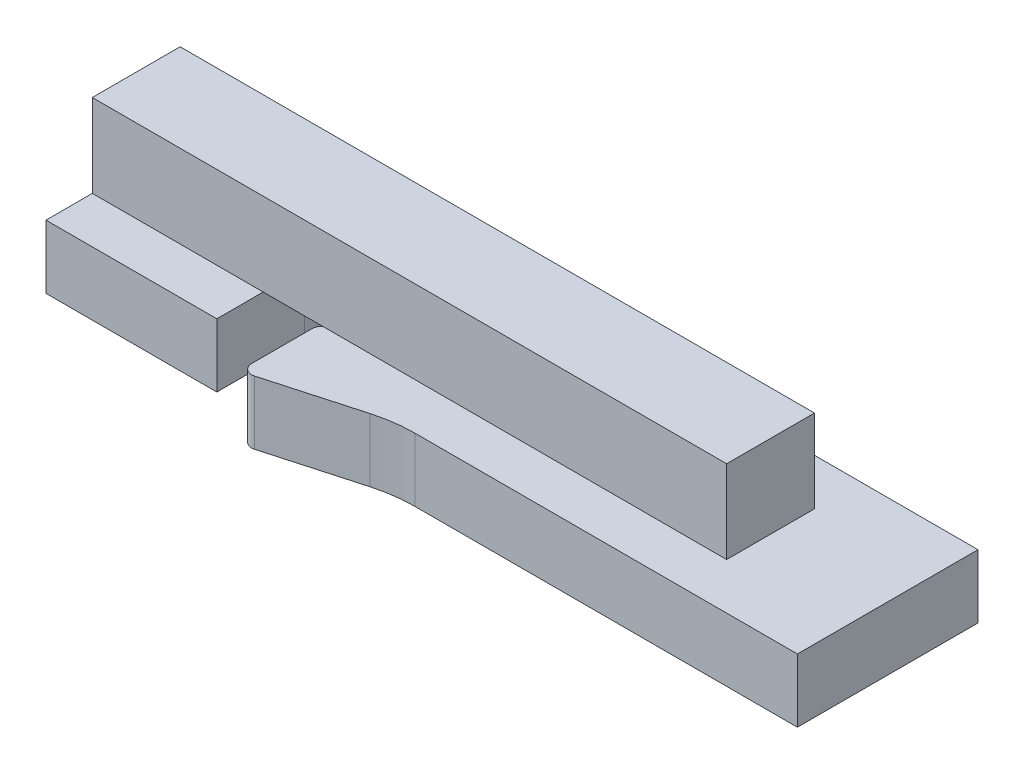
ISO-10303-21;
HEADER;
FILE_DESCRIPTION(('STEP AP214'),'2;1');
FILE_NAME('part.step','',(''),(''),'','','');
FILE_SCHEMA(('AUTOMOTIVE_DESIGN { 1 0 10303 214 1 1 1 1 }'));
ENDSEC;
DATA;
#1=APPLICATION_CONTEXT('core data for automotive mechanical design processes');
#2=APPLICATION_PROTOCOL_DEFINITION('international standard','automotive_design',2000,#1);
#3=PRODUCT_CONTEXT('',#1,'mechanical');
#4=PRODUCT('Part','Part','',(#3));
#5=PRODUCT_RELATED_PRODUCT_CATEGORY('part','',(#4));
#6=PRODUCT_DEFINITION_FORMATION('','',#4);
#7=PRODUCT_DEFINITION_CONTEXT('part definition',#1,'design');
#8=PRODUCT_DEFINITION('design','',#6,#7);
#9=PRODUCT_DEFINITION_SHAPE('','',#8);
#10=(LENGTH_UNIT() NAMED_UNIT(*) SI_UNIT(.MILLI.,.METRE.));
#11=(NAMED_UNIT(*) PLANE_ANGLE_UNIT() SI_UNIT($,.RADIAN.));
#12=(NAMED_UNIT(*) SI_UNIT($,.STERADIAN.) SOLID_ANGLE_UNIT());
#13=UNCERTAINTY_MEASURE_WITH_UNIT(LENGTH_MEASURE(1.E-05),#10,'distance_accuracy_value','');
#14=(GEOMETRIC_REPRESENTATION_CONTEXT(3) GLOBAL_UNCERTAINTY_ASSIGNED_CONTEXT((#13)) GLOBAL_UNIT_ASSIGNED_CONTEXT((#10,
#11,#12)) REPRESENTATION_CONTEXT('',''));
#15=CARTESIAN_POINT('',(0.,0.,0.));
#16=DIRECTION('',(0.,0.,1.));
#17=DIRECTION('',(1.,0.,0.));
#18=AXIS2_PLACEMENT_3D('',#15,#16,#17);
#19=CARTESIAN_POINT('',(0.,-299.515551231555,0.));
#20=DIRECTION('',(0.,-1.,0.));
#21=DIRECTION('',(0.,0.,-1.));
#22=AXIS2_PLACEMENT_3D('',#19,#20,#21);
#23=PLANE('',#22);
#24=DIRECTION('',(0.,0.,-1.));
#25=VECTOR('',#24,1.);
#26=CARTESIAN_POINT('',(4367.43626687539,-299.515551231555,24.1039140004574));
#27=LINE('',#26,#25);
#28=CARTESIAN_POINT('',(4367.43626687539,-299.515551231555,24.1039140004574));
#29=VERTEX_POINT('',#28);
#30=CARTESIAN_POINT('',(4367.43626687539,-299.515551231555,20.5039140004575));
#31=VERTEX_POINT('',#30);
#32=EDGE_CURVE('E351',#29,#31,#27,.T.);
#33=ORIENTED_EDGE('',*,*,#32,.F.);
#34=DIRECTION('',(-1.,0.,0.));
#35=VECTOR('',#34,1.);
#36=CARTESIAN_POINT('',(4367.43626687539,-299.515551231555,24.1039140004574));
#37=LINE('',#36,#35);
#38=CARTESIAN_POINT('',(4393.42735023895,-299.515551231555,24.1039140004575));
#39=VERTEX_POINT('',#38);
#40=EDGE_CURVE('E354',#39,#29,#37,.T.);
#41=ORIENTED_EDGE('',*,*,#40,.F.);
#42=DIRECTION('',(0.,0.,1.));
#43=VECTOR('',#42,1.);
#44=CARTESIAN_POINT('',(4393.42735023895,-299.515551231555,24.1039140004575));
#45=LINE('',#44,#43);
#46=CARTESIAN_POINT('',(4393.42735023895,-299.515551231555,20.5039140004575));
#47=VERTEX_POINT('',#46);
#48=EDGE_CURVE('E46',#47,#39,#45,.T.);
#49=ORIENTED_EDGE('',*,*,#48,.F.);
#50=DIRECTION('',(1.,0.,0.));
#51=VECTOR('',#50,1.);
#52=CARTESIAN_POINT('',(4367.43626687539,-299.515551231555,20.5039140004575));
#53=LINE('',#52,#51);
#54=EDGE_CURVE('E11',#31,#47,#53,.T.);
#55=ORIENTED_EDGE('',*,*,#54,.F.);
#56=EDGE_LOOP('',(#33,#41,#49,#55));
#57=FACE_BOUND('',#56,.T.);
#58=ADVANCED_FACE('F39',(#57),#23,.F.);
#59=CARTESIAN_POINT('',(4398.22735023895,-305.515551231555,18.6039140004575));
#60=DIRECTION('',(-1.,0.,0.));
#61=DIRECTION('',(0.,0.,1.));
#62=AXIS2_PLACEMENT_3D('',#59,#60,#61);
#63=PLANE('',#62);
#64=DIRECTION('',(0.,0.,1.));
#65=VECTOR('',#64,1.);
#66=CARTESIAN_POINT('',(4398.22735023895,-302.915551231555,18.6039140004575));
#67=LINE('',#66,#65);
#68=CARTESIAN_POINT('',(4398.22735023895,-302.915551231555,18.6039140004575));
#69=VERTEX_POINT('',#68);
#70=CARTESIAN_POINT('',(4398.22735023895,-302.915551231555,26.0039140004575));
#71=VERTEX_POINT('',#70);
#72=EDGE_CURVE('E185',#69,#71,#67,.T.);
#73=ORIENTED_EDGE('',*,*,#72,.T.);
#74=DIRECTION('',(0.,1.,0.));
#75=VECTOR('',#74,1.);
#76=CARTESIAN_POINT('',(4398.22735023895,-305.515551231555,26.0039140004575));
#77=LINE('',#76,#75);
#78=CARTESIAN_POINT('',(4398.22735023895,-305.515551231555,26.0039140004575));
#79=VERTEX_POINT('',#78);
#80=EDGE_CURVE('E189',#79,#71,#77,.T.);
#81=ORIENTED_EDGE('',*,*,#80,.F.);
#82=DIRECTION('',(0.,0.,1.));
#83=VECTOR('',#82,1.);
#84=CARTESIAN_POINT('',(4398.22735023895,-305.515551231555,18.6039140004575));
#85=LINE('',#84,#83);
#86=CARTESIAN_POINT('',(4398.22735023895,-305.515551231555,18.6039140004575));
#87=VERTEX_POINT('',#86);
#88=EDGE_CURVE('E214',#87,#79,#85,.T.);
#89=ORIENTED_EDGE('',*,*,#88,.F.);
#90=DIRECTION('',(0.,1.,0.));
#91=VECTOR('',#90,1.);
#92=CARTESIAN_POINT('',(4398.22735023895,-305.515551231555,18.6039140004575));
#93=LINE('',#92,#91);
#94=EDGE_CURVE('E192',#87,#69,#93,.T.);
#95=ORIENTED_EDGE('',*,*,#94,.T.);
#96=EDGE_LOOP('',(#73,#81,#89,#95));
#97=FACE_BOUND('',#96,.T.);
#98=ADVANCED_FACE('F187',(#97),#63,.F.);
#99=CARTESIAN_POINT('',(4389.42735023895,-305.515551231555,26.0039140004575));
#100=DIRECTION('',(0.,0.,-1.));
#101=DIRECTION('',(-1.,0.,0.));
#102=AXIS2_PLACEMENT_3D('',#99,#100,#101);
#103=PLANE('',#102);
#104=DIRECTION('',(-1.,0.,0.));
#105=VECTOR('',#104,1.);
#106=CARTESIAN_POINT('',(4389.42735023895,-302.915551231555,26.0039140004575));
#107=LINE('',#106,#105);
#108=CARTESIAN_POINT('',(4382.56517111144,-302.915551231555,26.0039140004575));
#109=VERTEX_POINT('',#108);
#110=EDGE_CURVE('E197',#71,#109,#107,.T.);
#111=ORIENTED_EDGE('',*,*,#110,.T.);
#112=DIRECTION('',(0.,-1.,0.));
#113=VECTOR('',#112,1.);
#114=CARTESIAN_POINT('',(4382.56517111144,-305.515551231555,26.0039140004575));
#115=LINE('',#114,#113);
#116=CARTESIAN_POINT('',(4382.56517111144,-305.515551231555,26.0039140004575));
#117=VERTEX_POINT('',#116);
#118=EDGE_CURVE('E386',#109,#117,#115,.T.);
#119=ORIENTED_EDGE('',*,*,#118,.T.);
#120=DIRECTION('',(-1.,0.,0.));
#121=VECTOR('',#120,1.);
#122=CARTESIAN_POINT('',(4389.42735023895,-305.515551231555,26.0039140004575));
#123=LINE('',#122,#121);
#124=EDGE_CURVE('E205',#79,#117,#123,.T.);
#125=ORIENTED_EDGE('',*,*,#124,.F.);
#126=ORIENTED_EDGE('',*,*,#80,.T.);
#127=EDGE_LOOP('',(#111,#119,#125,#126));
#128=FACE_BOUND('',#127,.T.);
#129=ADVANCED_FACE('F201',(#128),#103,.F.);
#130=CARTESIAN_POINT('',(4382.56517111144,-305.515551231555,32.0039140004575));
#131=DIRECTION('',(0.,-1.,0.));
#132=DIRECTION('',(0.,0.,-1.));
#133=AXIS2_PLACEMENT_3D('',#130,#131,#132);
#134=CYLINDRICAL_SURFACE('',#133,6.);
#135=CARTESIAN_POINT('',(4382.56517111144,-302.915551231555,32.0039140004575));
#136=DIRECTION('',(0.,-1.,0.));
#137=DIRECTION('',(0.,0.,-1.));
#138=AXIS2_PLACEMENT_3D('',#135,#136,#137);
#139=CIRCLE('',#138,6.);
#140=CARTESIAN_POINT('',(4380.94739155832,-302.915551231555,26.2261298821723));
#141=VERTEX_POINT('',#140);
#142=EDGE_CURVE('E210',#141,#109,#139,.T.);
#143=ORIENTED_EDGE('',*,*,#142,.F.);
#144=DIRECTION('',(0.,-1.,0.));
#145=VECTOR('',#144,1.);
#146=CARTESIAN_POINT('',(4380.94739155832,-289.781512159042,26.2261298821723));
#147=LINE('',#146,#145);
#148=CARTESIAN_POINT('',(4380.94739155832,-305.515551231555,26.2261298821723));
#149=VERTEX_POINT('',#148);
#150=EDGE_CURVE('E388',#149,#141,#147,.F.);
#151=ORIENTED_EDGE('',*,*,#150,.F.);
#152=CARTESIAN_POINT('',(4382.56517111144,-305.515551231555,32.0039140004575));
#153=DIRECTION('',(0.,-1.,0.));
#154=DIRECTION('',(0.,0.,-1.));
#155=AXIS2_PLACEMENT_3D('',#152,#153,#154);
#156=CIRCLE('',#155,6.);
#157=EDGE_CURVE('E400',#117,#149,#156,.F.);
#158=ORIENTED_EDGE('',*,*,#157,.F.);
#159=ORIENTED_EDGE('',*,*,#118,.F.);
#160=EDGE_LOOP('',(#143,#151,#158,#159));
#161=FACE_BOUND('',#160,.T.);
#162=ADVANCED_FACE('F277',(#161),#134,.F.);
#163=CARTESIAN_POINT('',(4381.7410197073,-289.781512159042,26.0039140004575));
#164=DIRECTION('',(0.269629925519976,0.,0.96296401971418));
#165=DIRECTION('',(0.96296401971418,0.,-0.269629925519976));
#166=AXIS2_PLACEMENT_3D('',#163,#164,#165);
#167=PLANE('',#166);
#168=DIRECTION('',(0.96296401971418,0.,-0.269629925519976));
#169=VECTOR('',#168,1.);
#170=CARTESIAN_POINT('',(4381.7410197073,-302.915551231555,26.0039140004575));
#171=LINE('',#170,#169);
#172=CARTESIAN_POINT('',(4377.24887167751,-302.915551231555,27.2617154487993));
#173=VERTEX_POINT('',#172);
#174=EDGE_CURVE('E477',#173,#141,#171,.T.);
#175=ORIENTED_EDGE('',*,*,#174,.F.);
#176=DIRECTION('',(0.,-1.,0.));
#177=VECTOR('',#176,1.);
#178=CARTESIAN_POINT('',(4377.24887167751,-289.781512159042,27.2617154487993));
#179=LINE('',#178,#177);
#180=CARTESIAN_POINT('',(4377.24887167751,-305.515551231555,27.2617154487993));
#181=VERTEX_POINT('',#180);
#182=EDGE_CURVE('E419',#173,#181,#179,.T.);
#183=ORIENTED_EDGE('',*,*,#182,.T.);
#184=DIRECTION('',(-0.96296401971418,0.,0.269629925519976));
#185=VECTOR('',#184,1.);
#186=CARTESIAN_POINT('',(4381.7410197073,-305.515551231555,26.0039140004575));
#187=LINE('',#186,#185);
#188=EDGE_CURVE('E480',#149,#181,#187,.T.);
#189=ORIENTED_EDGE('',*,*,#188,.F.);
#190=ORIENTED_EDGE('',*,*,#150,.T.);
#191=EDGE_LOOP('',(#175,#183,#189,#190));
#192=FACE_BOUND('',#191,.T.);
#193=ADVANCED_FACE('F280',(#192),#167,.T.);
#194=CARTESIAN_POINT('',(4377.1410197073,-289.781512159042,26.8765298409136));
#195=DIRECTION('',(0.,-1.,0.));
#196=DIRECTION('',(0.,0.,-1.));
#197=AXIS2_PLACEMENT_3D('',#194,#195,#196);
#198=CYLINDRICAL_SURFACE('',#197,0.4);
#199=CARTESIAN_POINT('',(4377.1410197073,-302.915551231555,26.8765298409136));
#200=DIRECTION('',(0.,-1.,0.));
#201=DIRECTION('',(0.,0.,-1.));
#202=AXIS2_PLACEMENT_3D('',#199,#200,#201);
#203=CIRCLE('',#202,0.4);
#204=CARTESIAN_POINT('',(4376.7410197073,-302.915551231555,26.8765298409136));
#205=VERTEX_POINT('',#204);
#206=EDGE_CURVE('E415',#205,#173,#203,.F.);
#207=ORIENTED_EDGE('',*,*,#206,.F.);
#208=DIRECTION('',(0.,-1.,0.));
#209=VECTOR('',#208,1.);
#210=CARTESIAN_POINT('',(4376.7410197073,-289.781512159042,26.8765298409136));
#211=LINE('',#210,#209);
#212=CARTESIAN_POINT('',(4376.7410197073,-305.515551231555,26.8765298409136));
#213=VERTEX_POINT('',#212);
#214=EDGE_CURVE('E403',#213,#205,#211,.F.);
#215=ORIENTED_EDGE('',*,*,#214,.F.);
#216=CARTESIAN_POINT('',(4377.1410197073,-305.515551231555,26.8765298409136));
#217=DIRECTION('',(0.,-1.,0.));
#218=DIRECTION('',(0.,0.,-1.));
#219=AXIS2_PLACEMENT_3D('',#216,#217,#218);
#220=CIRCLE('',#219,0.4);
#221=EDGE_CURVE('E408',#181,#213,#220,.T.);
#222=ORIENTED_EDGE('',*,*,#221,.F.);
#223=ORIENTED_EDGE('',*,*,#182,.F.);
#224=EDGE_LOOP('',(#207,#215,#222,#223));
#225=FACE_BOUND('',#224,.T.);
#226=ADVANCED_FACE('F288',(#225),#198,.T.);
#227=CARTESIAN_POINT('',(4376.7410197073,-289.781512159042,27.4039140004575));
#228=DIRECTION('',(-1.,0.,0.));
#229=DIRECTION('',(0.,0.,1.));
#230=AXIS2_PLACEMENT_3D('',#227,#228,#229);
#231=PLANE('',#230);
#232=DIRECTION('',(0.,0.,1.));
#233=VECTOR('',#232,1.);
#234=CARTESIAN_POINT('',(4376.7410197073,-302.915551231555,27.4039140004575));
#235=LINE('',#234,#233);
#236=CARTESIAN_POINT('',(4376.7410197073,-302.915551231555,24.4039140004575));
#237=VERTEX_POINT('',#236);
#238=EDGE_CURVE('E484',#237,#205,#235,.T.);
#239=ORIENTED_EDGE('',*,*,#238,.F.);
#240=DIRECTION('',(0.,-1.,0.));
#241=VECTOR('',#240,1.);
#242=CARTESIAN_POINT('',(4376.7410197073,-289.781512159042,24.4039140004575));
#243=LINE('',#242,#241);
#244=CARTESIAN_POINT('',(4376.7410197073,-305.515551231555,24.4039140004575));
#245=VERTEX_POINT('',#244);
#246=EDGE_CURVE('E405',#237,#245,#243,.T.);
#247=ORIENTED_EDGE('',*,*,#246,.T.);
#248=DIRECTION('',(0.,0.,-1.));
#249=VECTOR('',#248,1.);
#250=CARTESIAN_POINT('',(4376.7410197073,-305.515551231555,27.4039140004575));
#251=LINE('',#250,#249);
#252=EDGE_CURVE('E478',#213,#245,#251,.T.);
#253=ORIENTED_EDGE('',*,*,#252,.F.);
#254=ORIENTED_EDGE('',*,*,#214,.T.);
#255=EDGE_LOOP('',(#239,#247,#253,#254));
#256=FACE_BOUND('',#255,.T.);
#257=ADVANCED_FACE('F291',(#256),#231,.T.);
#258=CARTESIAN_POINT('',(4387.92735023895,-305.515551231555,22.4039140004575));
#259=DIRECTION('',(0.,-1.,0.));
#260=DIRECTION('',(0.,0.,-1.));
#261=AXIS2_PLACEMENT_3D('',#258,#259,#260);
#262=CYLINDRICAL_SURFACE('',#261,1.5);
#263=CARTESIAN_POINT('',(4387.92735023895,-302.915551231555,22.4039140004575));
#264=DIRECTION('',(0.,-1.,0.));
#265=DIRECTION('',(0.,0.,-1.));
#266=AXIS2_PLACEMENT_3D('',#263,#264,#265);
#267=CIRCLE('',#266,1.5);
#268=CARTESIAN_POINT('',(4387.92735023895,-302.915551231555,20.9039140004575));
#269=VERTEX_POINT('',#268);
#270=CARTESIAN_POINT('',(4389.42735023895,-302.915551231555,22.4039140004575));
#271=VERTEX_POINT('',#270);
#272=EDGE_CURVE('E435',#269,#271,#267,.T.);
#273=ORIENTED_EDGE('',*,*,#272,.F.);
#274=DIRECTION('',(0.,-1.,0.));
#275=VECTOR('',#274,1.);
#276=CARTESIAN_POINT('',(4387.92735023895,-287.753753752236,20.9039140004575));
#277=LINE('',#276,#275);
#278=CARTESIAN_POINT('',(4387.92735023895,-305.515551231555,20.9039140004575));
#279=VERTEX_POINT('',#278);
#280=EDGE_CURVE('E442',#279,#269,#277,.F.);
#281=ORIENTED_EDGE('',*,*,#280,.F.);
#282=CARTESIAN_POINT('',(4387.92735023895,-305.515551231555,22.4039140004575));
#283=DIRECTION('',(0.,-1.,0.));
#284=DIRECTION('',(0.,0.,-1.));
#285=AXIS2_PLACEMENT_3D('',#282,#283,#284);
#286=CIRCLE('',#285,1.5);
#287=CARTESIAN_POINT('',(4389.42735023895,-305.515551231555,22.4039140004575));
#288=VERTEX_POINT('',#287);
#289=EDGE_CURVE('E448',#288,#279,#286,.F.);
#290=ORIENTED_EDGE('',*,*,#289,.F.);
#291=DIRECTION('',(0.,-1.,0.));
#292=VECTOR('',#291,1.);
#293=CARTESIAN_POINT('',(4389.42735023895,-305.515551231555,22.4039140004575));
#294=LINE('',#293,#292);
#295=EDGE_CURVE('E428',#271,#288,#294,.T.);
#296=ORIENTED_EDGE('',*,*,#295,.F.);
#297=EDGE_LOOP('',(#273,#281,#290,#296));
#298=FACE_BOUND('',#297,.T.);
#299=ADVANCED_FACE('F298',(#298),#262,.F.);
#300=CARTESIAN_POINT('',(4374.4410197073,-287.753753752236,20.9039140004575));
#301=DIRECTION('',(0.,0.,1.));
#302=DIRECTION('',(1.,0.,0.));
#303=AXIS2_PLACEMENT_3D('',#300,#301,#302);
#304=PLANE('',#303);
#305=DIRECTION('',(-1.,0.,0.));
#306=VECTOR('',#305,1.);
#307=CARTESIAN_POINT('',(4374.4410197073,-305.515551231555,20.9039140004575));
#308=LINE('',#307,#306);
#309=CARTESIAN_POINT('',(4375.9410197073,-305.515551231555,20.9039140004575));
#310=VERTEX_POINT('',#309);
#311=EDGE_CURVE('E455',#279,#310,#308,.T.);
#312=ORIENTED_EDGE('',*,*,#311,.F.);
#313=ORIENTED_EDGE('',*,*,#280,.T.);
#314=DIRECTION('',(1.,0.,0.));
#315=VECTOR('',#314,1.);
#316=CARTESIAN_POINT('',(4374.4410197073,-302.915551231555,20.9039140004575));
#317=LINE('',#316,#315);
#318=CARTESIAN_POINT('',(4375.9410197073,-302.915551231555,20.9039140004575));
#319=VERTEX_POINT('',#318);
#320=EDGE_CURVE('E467',#319,#269,#317,.T.);
#321=ORIENTED_EDGE('',*,*,#320,.F.);
#322=DIRECTION('',(0.,-1.,0.));
#323=VECTOR('',#322,1.);
#324=CARTESIAN_POINT('',(4375.9410197073,-287.753753752236,20.9039140004575));
#325=LINE('',#324,#323);
#326=EDGE_CURVE('E439',#319,#310,#325,.T.);
#327=ORIENTED_EDGE('',*,*,#326,.T.);
#328=EDGE_LOOP('',(#312,#313,#321,#327));
#329=FACE_BOUND('',#328,.T.);
#330=ADVANCED_FACE('F300',(#329),#304,.T.);
#331=CARTESIAN_POINT('',(4375.9410197073,-287.753753752236,22.4039140004575));
#332=DIRECTION('',(0.,-1.,0.));
#333=DIRECTION('',(0.,0.,-1.));
#334=AXIS2_PLACEMENT_3D('',#331,#332,#333);
#335=CYLINDRICAL_SURFACE('',#334,1.5);
#336=CARTESIAN_POINT('',(4375.9410197073,-302.915551231555,22.4039140004575));
#337=DIRECTION('',(0.,-1.,0.));
#338=DIRECTION('',(0.,0.,-1.));
#339=AXIS2_PLACEMENT_3D('',#336,#337,#338);
#340=CIRCLE('',#339,1.5);
#341=CARTESIAN_POINT('',(4374.4410197073,-302.915551231555,22.4039140004575));
#342=VERTEX_POINT('',#341);
#343=EDGE_CURVE('E433',#342,#319,#340,.T.);
#344=ORIENTED_EDGE('',*,*,#343,.F.);
#345=DIRECTION('',(0.,-1.,0.));
#346=VECTOR('',#345,1.);
#347=CARTESIAN_POINT('',(4374.4410197073,-305.515551231555,22.4039140004575));
#348=LINE('',#347,#346);
#349=CARTESIAN_POINT('',(4374.4410197073,-305.515551231555,22.4039140004575));
#350=VERTEX_POINT('',#349);
#351=EDGE_CURVE('E444',#350,#342,#348,.F.);
#352=ORIENTED_EDGE('',*,*,#351,.F.);
#353=CARTESIAN_POINT('',(4375.9410197073,-305.515551231555,22.4039140004575));
#354=DIRECTION('',(0.,-1.,0.));
#355=DIRECTION('',(0.,0.,-1.));
#356=AXIS2_PLACEMENT_3D('',#353,#354,#355);
#357=CIRCLE('',#356,1.5);
#358=EDGE_CURVE('E355',#310,#350,#357,.F.);
#359=ORIENTED_EDGE('',*,*,#358,.F.);
#360=ORIENTED_EDGE('',*,*,#326,.F.);
#361=EDGE_LOOP('',(#344,#352,#359,#360));
#362=FACE_BOUND('',#361,.T.);
#363=ADVANCED_FACE('F286',(#362),#335,.F.);
#364=CARTESIAN_POINT('',(4377.1410197073,-289.781512159042,24.4039140004575));
#365=DIRECTION('',(0.,-1.,0.));
#366=DIRECTION('',(0.,0.,-1.));
#367=AXIS2_PLACEMENT_3D('',#364,#365,#366);
#368=CYLINDRICAL_SURFACE('',#367,0.4);
#369=CARTESIAN_POINT('',(4377.1410197073,-302.915551231555,24.4039140004575));
#370=DIRECTION('',(0.,-1.,0.));
#371=DIRECTION('',(0.,0.,-1.));
#372=AXIS2_PLACEMENT_3D('',#369,#370,#371);
#373=CIRCLE('',#372,0.4);
#374=CARTESIAN_POINT('',(4377.1410197073,-302.915551231555,24.0039140004575));
#375=VERTEX_POINT('',#374);
#376=CARTESIAN_POINT('',(4376.8764445762,-302.915551231555,24.1039140004575));
#377=VERTEX_POINT('',#376);
#378=EDGE_CURVE('E422',#375,#377,#373,.F.);
#379=ORIENTED_EDGE('',*,*,#378,.F.);
#380=DIRECTION('',(0.,-1.,0.));
#381=VECTOR('',#380,1.);
#382=CARTESIAN_POINT('',(4377.1410197073,-289.781512159042,24.0039140004575));
#383=LINE('',#382,#381);
#384=CARTESIAN_POINT('',(4377.1410197073,-305.515551231555,24.0039140004575));
#385=VERTEX_POINT('',#384);
#386=EDGE_CURVE('E412',#385,#375,#383,.F.);
#387=ORIENTED_EDGE('',*,*,#386,.F.);
#388=CARTESIAN_POINT('',(4377.1410197073,-305.515551231555,24.4039140004575));
#389=DIRECTION('',(0.,-1.,0.));
#390=DIRECTION('',(0.,0.,-1.));
#391=AXIS2_PLACEMENT_3D('',#388,#389,#390);
#392=CIRCLE('',#391,0.4);
#393=EDGE_CURVE('E410',#245,#385,#392,.T.);
#394=ORIENTED_EDGE('',*,*,#393,.F.);
#395=ORIENTED_EDGE('',*,*,#246,.F.);
#396=CARTESIAN_POINT('',(4377.1410197073,-302.915551231555,24.4039140004575));
#397=DIRECTION('',(0.,-1.,0.));
#398=DIRECTION('',(0.,0.,-1.));
#399=AXIS2_PLACEMENT_3D('',#396,#397,#398);
#400=CIRCLE('',#399,0.4);
#401=EDGE_CURVE('E417',#377,#237,#400,.F.);
#402=ORIENTED_EDGE('',*,*,#401,.F.);
#403=EDGE_LOOP('',(#379,#387,#394,#395,#402));
#404=FACE_BOUND('',#403,.T.);
#405=ADVANCED_FACE('F282',(#404),#368,.T.);
#406=CARTESIAN_POINT('',(4376.7410197073,-289.781512159042,24.0039140004575));
#407=DIRECTION('',(0.,0.,-1.));
#408=DIRECTION('',(-1.,0.,0.));
#409=AXIS2_PLACEMENT_3D('',#406,#407,#408);
#410=PLANE('',#409);
#411=DIRECTION('',(-1.,0.,0.));
#412=VECTOR('',#411,1.);
#413=CARTESIAN_POINT('',(4376.7410197073,-302.915551231555,24.0039140004575));
#414=LINE('',#413,#412);
#415=CARTESIAN_POINT('',(4387.92735023895,-302.915551231555,24.0039140004575));
#416=VERTEX_POINT('',#415);
#417=EDGE_CURVE('E471',#416,#375,#414,.T.);
#418=ORIENTED_EDGE('',*,*,#417,.F.);
#419=DIRECTION('',(0.,-1.,0.));
#420=VECTOR('',#419,1.);
#421=CARTESIAN_POINT('',(4387.92735023895,-289.781512159042,24.0039140004575));
#422=LINE('',#421,#420);
#423=CARTESIAN_POINT('',(4387.92735023895,-305.515551231555,24.0039140004575));
#424=VERTEX_POINT('',#423);
#425=EDGE_CURVE('E425',#416,#424,#422,.T.);
#426=ORIENTED_EDGE('',*,*,#425,.T.);
#427=DIRECTION('',(1.,0.,0.));
#428=VECTOR('',#427,1.);
#429=CARTESIAN_POINT('',(4376.7410197073,-305.515551231555,24.0039140004575));
#430=LINE('',#429,#428);
#431=EDGE_CURVE('E474',#385,#424,#430,.T.);
#432=ORIENTED_EDGE('',*,*,#431,.F.);
#433=ORIENTED_EDGE('',*,*,#386,.T.);
#434=EDGE_LOOP('',(#418,#426,#432,#433));
#435=FACE_BOUND('',#434,.T.);
#436=ADVANCED_FACE('F285',(#435),#410,.T.);
#437=CARTESIAN_POINT('',(4387.92735023895,-289.781512159042,22.5039140004575));
#438=DIRECTION('',(0.,-1.,0.));
#439=DIRECTION('',(0.,0.,-1.));
#440=AXIS2_PLACEMENT_3D('',#437,#438,#439);
#441=CYLINDRICAL_SURFACE('',#440,1.5);
#442=CARTESIAN_POINT('',(4387.92735023895,-302.915551231555,22.5039140004575));
#443=DIRECTION('',(0.,-1.,0.));
#444=DIRECTION('',(0.,0.,-1.));
#445=AXIS2_PLACEMENT_3D('',#442,#443,#444);
#446=CIRCLE('',#445,1.5);
#447=CARTESIAN_POINT('',(4389.42735023895,-302.915551231555,22.5039140004575));
#448=VERTEX_POINT('',#447);
#449=EDGE_CURVE('E437',#448,#416,#446,.T.);
#450=ORIENTED_EDGE('',*,*,#449,.F.);
#451=DIRECTION('',(0.,-1.,0.));
#452=VECTOR('',#451,1.);
#453=CARTESIAN_POINT('',(4389.42735023895,-305.515551231555,22.5039140004575));
#454=LINE('',#453,#452);
#455=CARTESIAN_POINT('',(4389.42735023895,-305.515551231555,22.5039140004575));
#456=VERTEX_POINT('',#455);
#457=EDGE_CURVE('E431',#456,#448,#454,.F.);
#458=ORIENTED_EDGE('',*,*,#457,.F.);
#459=CARTESIAN_POINT('',(4387.92735023895,-305.515551231555,22.5039140004575));
#460=DIRECTION('',(0.,-1.,0.));
#461=DIRECTION('',(0.,0.,-1.));
#462=AXIS2_PLACEMENT_3D('',#459,#460,#461);
#463=CIRCLE('',#462,1.5);
#464=EDGE_CURVE('E446',#424,#456,#463,.F.);
#465=ORIENTED_EDGE('',*,*,#464,.F.);
#466=ORIENTED_EDGE('',*,*,#425,.F.);
#467=EDGE_LOOP('',(#450,#458,#465,#466));
#468=FACE_BOUND('',#467,.T.);
#469=ADVANCED_FACE('F293',(#468),#441,.F.);
#470=CARTESIAN_POINT('',(4389.42735023895,-305.515551231555,18.6039140004575));
#471=DIRECTION('',(1.,0.,0.));
#472=DIRECTION('',(0.,0.,-1.));
#473=AXIS2_PLACEMENT_3D('',#470,#471,#472);
#474=PLANE('',#473);
#475=DIRECTION('',(0.,0.,-1.));
#476=VECTOR('',#475,1.);
#477=CARTESIAN_POINT('',(4389.42735023895,-305.515551231555,18.6039140004575));
#478=LINE('',#477,#476);
#479=EDGE_CURVE('E211',#456,#288,#478,.T.);
#480=ORIENTED_EDGE('',*,*,#479,.F.);
#481=ORIENTED_EDGE('',*,*,#457,.T.);
#482=DIRECTION('',(0.,0.,-1.));
#483=VECTOR('',#482,1.);
#484=CARTESIAN_POINT('',(4389.42735023895,-302.915551231555,18.6039140004575));
#485=LINE('',#484,#483);
#486=EDGE_CURVE('E218',#448,#271,#485,.T.);
#487=ORIENTED_EDGE('',*,*,#486,.T.);
#488=ORIENTED_EDGE('',*,*,#295,.T.);
#489=EDGE_LOOP('',(#480,#481,#487,#488));
#490=FACE_BOUND('',#489,.T.);
#491=ADVANCED_FACE('F296',(#490),#474,.F.);
#492=CARTESIAN_POINT('',(4374.4410197073,-305.515551231555,26.0039140004575));
#493=DIRECTION('',(-1.,0.,0.));
#494=DIRECTION('',(0.,0.,1.));
#495=AXIS2_PLACEMENT_3D('',#492,#493,#494);
#496=PLANE('',#495);
#497=DIRECTION('',(0.,0.,1.));
#498=VECTOR('',#497,1.);
#499=CARTESIAN_POINT('',(4374.4410197073,-305.515551231555,26.0039140004575));
#500=LINE('',#499,#498);
#501=CARTESIAN_POINT('',(4374.4410197073,-305.515551231555,26.0039140004575));
#502=VERTEX_POINT('',#501);
#503=EDGE_CURVE('E244',#350,#502,#500,.T.);
#504=ORIENTED_EDGE('',*,*,#503,.F.);
#505=ORIENTED_EDGE('',*,*,#351,.T.);
#506=DIRECTION('',(0.,0.,1.));
#507=VECTOR('',#506,1.);
#508=CARTESIAN_POINT('',(4374.4410197073,-302.915551231555,26.0039140004575));
#509=LINE('',#508,#507);
#510=CARTESIAN_POINT('',(4374.4410197073,-302.915551231555,24.1039140004574));
#511=VERTEX_POINT('',#510);
#512=EDGE_CURVE('E249',#342,#511,#509,.T.);
#513=ORIENTED_EDGE('',*,*,#512,.T.);
#514=CARTESIAN_POINT('',(4374.4410197073,-302.915551231555,26.0039140004575));
#515=VERTEX_POINT('',#514);
#516=EDGE_CURVE('E251',#511,#515,#509,.T.);
#517=ORIENTED_EDGE('',*,*,#516,.T.);
#518=DIRECTION('',(0.,1.,0.));
#519=VECTOR('',#518,1.);
#520=CARTESIAN_POINT('',(4374.4410197073,-305.515551231555,26.0039140004575));
#521=LINE('',#520,#519);
#522=EDGE_CURVE('E252',#502,#515,#521,.T.);
#523=ORIENTED_EDGE('',*,*,#522,.F.);
#524=EDGE_LOOP('',(#504,#505,#513,#517,#523));
#525=FACE_BOUND('',#524,.T.);
#526=ADVANCED_FACE('F459',(#525),#496,.F.);
#527=CARTESIAN_POINT('',(4367.4410197073,-305.515551231555,26.0039140004575));
#528=DIRECTION('',(0.,0.,-1.));
#529=DIRECTION('',(-1.,0.,0.));
#530=AXIS2_PLACEMENT_3D('',#527,#528,#529);
#531=PLANE('',#530);
#532=DIRECTION('',(-1.,0.,0.));
#533=VECTOR('',#532,1.);
#534=CARTESIAN_POINT('',(4367.4410197073,-302.915551231555,26.0039140004575));
#535=LINE('',#534,#533);
#536=CARTESIAN_POINT('',(4367.4410197073,-302.915551231555,26.0039140004575));
#537=VERTEX_POINT('',#536);
#538=EDGE_CURVE('E242',#515,#537,#535,.T.);
#539=ORIENTED_EDGE('',*,*,#538,.T.);
#540=DIRECTION('',(0.,1.,0.));
#541=VECTOR('',#540,1.);
#542=CARTESIAN_POINT('',(4367.4410197073,-305.515551231555,26.0039140004575));
#543=LINE('',#542,#541);
#544=CARTESIAN_POINT('',(4367.4410197073,-305.515551231555,26.0039140004575));
#545=VERTEX_POINT('',#544);
#546=EDGE_CURVE('E248',#545,#537,#543,.T.);
#547=ORIENTED_EDGE('',*,*,#546,.F.);
#548=DIRECTION('',(-1.,0.,0.));
#549=VECTOR('',#548,1.);
#550=CARTESIAN_POINT('',(4367.4410197073,-305.515551231555,26.0039140004575));
#551=LINE('',#550,#549);
#552=EDGE_CURVE('E246',#502,#545,#551,.T.);
#553=ORIENTED_EDGE('',*,*,#552,.F.);
#554=ORIENTED_EDGE('',*,*,#522,.T.);
#555=EDGE_LOOP('',(#539,#547,#553,#554));
#556=FACE_BOUND('',#555,.T.);
#557=ADVANCED_FACE('F497',(#556),#531,.F.);
#558=CARTESIAN_POINT('',(0.,-305.515551231555,0.));
#559=DIRECTION('',(0.,-1.,0.));
#560=DIRECTION('',(0.,0.,-1.));
#561=AXIS2_PLACEMENT_3D('',#558,#559,#560);
#562=PLANE('',#561);
#563=ORIENTED_EDGE('',*,*,#252,.T.);
#564=ORIENTED_EDGE('',*,*,#393,.T.);
#565=ORIENTED_EDGE('',*,*,#431,.T.);
#566=ORIENTED_EDGE('',*,*,#464,.T.);
#567=ORIENTED_EDGE('',*,*,#479,.T.);
#568=ORIENTED_EDGE('',*,*,#289,.T.);
#569=ORIENTED_EDGE('',*,*,#311,.T.);
#570=ORIENTED_EDGE('',*,*,#358,.T.);
#571=ORIENTED_EDGE('',*,*,#503,.T.);
#572=ORIENTED_EDGE('',*,*,#552,.T.);
#573=DIRECTION('',(0.,0.,-1.));
#574=VECTOR('',#573,1.);
#575=CARTESIAN_POINT('',(4367.4410197073,-305.515551231555,26.0039140004575));
#576=LINE('',#575,#574);
#577=CARTESIAN_POINT('',(4367.4410197073,-305.515551231555,18.6039140004575));
#578=VERTEX_POINT('',#577);
#579=EDGE_CURVE('E238',#545,#578,#576,.T.);
#580=ORIENTED_EDGE('',*,*,#579,.T.);
#581=DIRECTION('',(1.,0.,0.));
#582=VECTOR('',#581,1.);
#583=CARTESIAN_POINT('',(4367.4410197073,-305.515551231555,18.6039140004575));
#584=LINE('',#583,#582);
#585=EDGE_CURVE('E241',#578,#87,#584,.T.);
#586=ORIENTED_EDGE('',*,*,#585,.T.);
#587=ORIENTED_EDGE('',*,*,#88,.T.);
#588=ORIENTED_EDGE('',*,*,#124,.T.);
#589=ORIENTED_EDGE('',*,*,#157,.T.);
#590=ORIENTED_EDGE('',*,*,#188,.T.);
#591=ORIENTED_EDGE('',*,*,#221,.T.);
#592=EDGE_LOOP('',(#563,#564,#565,#566,#567,#568,#569,#570,#571,#572,#580,#586,#587,#588,#589,
#590,#591));
#593=FACE_BOUND('',#592,.T.);
#594=ADVANCED_FACE('F331',(#593),#562,.T.);
#595=CARTESIAN_POINT('',(4367.4410197073,-305.515551231555,18.6039140004575));
#596=DIRECTION('',(0.,0.,1.));
#597=DIRECTION('',(1.,0.,0.));
#598=AXIS2_PLACEMENT_3D('',#595,#596,#597);
#599=PLANE('',#598);
#600=DIRECTION('',(1.,0.,0.));
#601=VECTOR('',#600,1.);
#602=CARTESIAN_POINT('',(4367.4410197073,-302.915551231555,18.6039140004575));
#603=LINE('',#602,#601);
#604=CARTESIAN_POINT('',(4367.4410197073,-302.915551231555,18.6039140004575));
#605=VERTEX_POINT('',#604);
#606=EDGE_CURVE('E380',#605,#69,#603,.T.);
#607=ORIENTED_EDGE('',*,*,#606,.T.);
#608=ORIENTED_EDGE('',*,*,#94,.F.);
#609=ORIENTED_EDGE('',*,*,#585,.F.);
#610=DIRECTION('',(0.,1.,0.));
#611=VECTOR('',#610,1.);
#612=CARTESIAN_POINT('',(4367.4410197073,-305.515551231555,18.6039140004575));
#613=LINE('',#612,#611);
#614=EDGE_CURVE('E255',#578,#605,#613,.T.);
#615=ORIENTED_EDGE('',*,*,#614,.T.);
#616=EDGE_LOOP('',(#607,#608,#609,#615));
#617=FACE_BOUND('',#616,.T.);
#618=ADVANCED_FACE('F275',(#617),#599,.F.);
#619=CARTESIAN_POINT('',(0.,-302.915551231555,0.));
#620=DIRECTION('',(0.,-1.,0.));
#621=DIRECTION('',(0.,0.,-1.));
#622=AXIS2_PLACEMENT_3D('',#619,#620,#621);
#623=PLANE('',#622);
#624=DIRECTION('',(1.,0.,0.));
#625=VECTOR('',#624,1.);
#626=CARTESIAN_POINT('',(4367.43626687539,-302.915551231555,24.1039140004574));
#627=LINE('',#626,#625);
#628=CARTESIAN_POINT('',(4393.42735023895,-302.915551231555,24.1039140004575));
#629=VERTEX_POINT('',#628);
#630=EDGE_CURVE('E225',#377,#629,#627,.T.);
#631=ORIENTED_EDGE('',*,*,#630,.F.);
#632=ORIENTED_EDGE('',*,*,#401,.T.);
#633=ORIENTED_EDGE('',*,*,#238,.T.);
#634=ORIENTED_EDGE('',*,*,#206,.T.);
#635=ORIENTED_EDGE('',*,*,#174,.T.);
#636=ORIENTED_EDGE('',*,*,#142,.T.);
#637=ORIENTED_EDGE('',*,*,#110,.F.);
#638=ORIENTED_EDGE('',*,*,#72,.F.);
#639=ORIENTED_EDGE('',*,*,#606,.F.);
#640=DIRECTION('',(0.,0.,-1.));
#641=VECTOR('',#640,1.);
#642=CARTESIAN_POINT('',(4367.4410197073,-302.915551231555,26.0039140004575));
#643=LINE('',#642,#641);
#644=CARTESIAN_POINT('',(4367.43864329135,-302.915551231555,20.5039140004575));
#645=VERTEX_POINT('',#644);
#646=EDGE_CURVE('E221',#645,#605,#643,.T.);
#647=ORIENTED_EDGE('',*,*,#646,.F.);
#648=DIRECTION('',(-1.,0.,0.));
#649=VECTOR('',#648,1.);
#650=CARTESIAN_POINT('',(4367.43626687539,-302.915551231555,20.5039140004575));
#651=LINE('',#650,#649);
#652=CARTESIAN_POINT('',(4393.42735023895,-302.915551231555,20.5039140004575));
#653=VERTEX_POINT('',#652);
#654=EDGE_CURVE('E384',#653,#645,#651,.T.);
#655=ORIENTED_EDGE('',*,*,#654,.F.);
#656=DIRECTION('',(0.,0.,-1.));
#657=VECTOR('',#656,1.);
#658=CARTESIAN_POINT('',(4393.42735023895,-302.915551231555,24.1039140004575));
#659=LINE('',#658,#657);
#660=EDGE_CURVE('E230',#629,#653,#659,.T.);
#661=ORIENTED_EDGE('',*,*,#660,.F.);
#662=EDGE_LOOP('',(#631,#632,#633,#634,#635,#636,#637,#638,#639,#647,#655,#661));
#663=FACE_BOUND('',#662,.T.);
#664=ADVANCED_FACE('F208',(#663),#623,.F.);
#665=CARTESIAN_POINT('',(0.,-302.915551231555,0.));
#666=DIRECTION('',(0.,-1.,0.));
#667=DIRECTION('',(0.,0.,-1.));
#668=AXIS2_PLACEMENT_3D('',#665,#666,#667);
#669=PLANE('',#668);
#670=ORIENTED_EDGE('',*,*,#486,.F.);
#671=ORIENTED_EDGE('',*,*,#449,.T.);
#672=ORIENTED_EDGE('',*,*,#417,.T.);
#673=ORIENTED_EDGE('',*,*,#378,.T.);
#674=EDGE_CURVE('E229',#511,#377,#627,.T.);
#675=ORIENTED_EDGE('',*,*,#674,.F.);
#676=ORIENTED_EDGE('',*,*,#512,.F.);
#677=ORIENTED_EDGE('',*,*,#343,.T.);
#678=ORIENTED_EDGE('',*,*,#320,.T.);
#679=ORIENTED_EDGE('',*,*,#272,.T.);
#680=EDGE_LOOP('',(#670,#671,#672,#673,#675,#676,#677,#678,#679));
#681=FACE_BOUND('',#680,.T.);
#682=ADVANCED_FACE('F466',(#681),#669,.T.);
#683=CARTESIAN_POINT('',(4367.43864329135,-302.915551231555,24.1039140004574));
#684=VERTEX_POINT('',#683);
#685=EDGE_CURVE('E234',#684,#511,#627,.T.);
#686=ORIENTED_EDGE('',*,*,#685,.F.);
#687=DIRECTION('',(0.,0.,-1.));
#688=VECTOR('',#687,1.);
#689=CARTESIAN_POINT('',(4367.4410197073,-302.915551231555,26.0039140004575));
#690=LINE('',#689,#688);
#691=EDGE_CURVE('E373',#537,#684,#690,.T.);
#692=ORIENTED_EDGE('',*,*,#691,.F.);
#693=ORIENTED_EDGE('',*,*,#538,.F.);
#694=ORIENTED_EDGE('',*,*,#516,.F.);
#695=EDGE_LOOP('',(#686,#692,#693,#694));
#696=FACE_BOUND('',#695,.T.);
#697=ADVANCED_FACE('F371',(#696),#623,.F.);
#698=CARTESIAN_POINT('',(4393.42735023895,-203.332258126622,24.1039140004575));
#699=DIRECTION('',(-1.,0.,0.));
#700=DIRECTION('',(0.,0.,1.));
#701=AXIS2_PLACEMENT_3D('',#698,#699,#700);
#702=PLANE('',#701);
#703=DIRECTION('',(0.,-1.,0.));
#704=VECTOR('',#703,1.);
#705=CARTESIAN_POINT('',(4393.42735023895,-203.332258126622,20.5039140004575));
#706=LINE('',#705,#704);
#707=EDGE_CURVE('E349',#47,#653,#706,.T.);
#708=ORIENTED_EDGE('',*,*,#707,.F.);
#709=ORIENTED_EDGE('',*,*,#48,.T.);
#710=DIRECTION('',(0.,-1.,0.));
#711=VECTOR('',#710,1.);
#712=CARTESIAN_POINT('',(4393.42735023895,-203.332258126622,24.1039140004575));
#713=LINE('',#712,#711);
#714=EDGE_CURVE('E358',#39,#629,#713,.T.);
#715=ORIENTED_EDGE('',*,*,#714,.T.);
#716=ORIENTED_EDGE('',*,*,#660,.T.);
#717=EDGE_LOOP('',(#708,#709,#715,#716));
#718=FACE_BOUND('',#717,.T.);
#719=ADVANCED_FACE('F273',(#718),#702,.F.);
#720=CARTESIAN_POINT('',(4367.4410197073,-305.515551231555,26.0039140004575));
#721=DIRECTION('',(1.,0.,0.));
#722=DIRECTION('',(0.,0.,-1.));
#723=AXIS2_PLACEMENT_3D('',#720,#721,#722);
#724=PLANE('',#723);
#725=ORIENTED_EDGE('',*,*,#691,.T.);
#726=CARTESIAN_POINT('',(4367.43626687539,-302.915551231555,20.5039140004575));
#727=DIRECTION('',(0.,0.,1.));
#728=VECTOR('',#727,1.);
#729=LINE('',#726,#728);
#730=EDGE_CURVE('E196',#645,#684,#729,.T.);
#731=ORIENTED_EDGE('',*,*,#730,.F.);
#732=ORIENTED_EDGE('',*,*,#646,.T.);
#733=ORIENTED_EDGE('',*,*,#614,.F.);
#734=ORIENTED_EDGE('',*,*,#579,.F.);
#735=ORIENTED_EDGE('',*,*,#546,.T.);
#736=EDGE_LOOP('',(#725,#731,#732,#733,#734,#735));
#737=FACE_BOUND('',#736,.T.);
#738=ADVANCED_FACE('F262',(#737),#724,.F.);
#739=CARTESIAN_POINT('',(4367.43626687539,-203.332258126622,20.5039140004575));
#740=DIRECTION('',(0.,0.,1.));
#741=DIRECTION('',(1.,0.,0.));
#742=AXIS2_PLACEMENT_3D('',#739,#740,#741);
#743=PLANE('',#742);
#744=DIRECTION('',(0.,-1.,0.));
#745=VECTOR('',#744,1.);
#746=CARTESIAN_POINT('',(4367.43626687539,-203.332258126622,20.5039140004575));
#747=LINE('',#746,#745);
#748=EDGE_CURVE('E346',#31,#645,#747,.T.);
#749=ORIENTED_EDGE('',*,*,#748,.F.);
#750=ORIENTED_EDGE('',*,*,#54,.T.);
#751=ORIENTED_EDGE('',*,*,#707,.T.);
#752=ORIENTED_EDGE('',*,*,#654,.T.);
#753=EDGE_LOOP('',(#749,#750,#751,#752));
#754=FACE_BOUND('',#753,.T.);
#755=ADVANCED_FACE('F272',(#754),#743,.F.);
#756=CARTESIAN_POINT('',(4367.43626687539,-203.332258126622,24.1039140004574));
#757=DIRECTION('',(0.,0.,-1.));
#758=DIRECTION('',(-1.,0.,0.));
#759=AXIS2_PLACEMENT_3D('',#756,#757,#758);
#760=PLANE('',#759);
#761=ORIENTED_EDGE('',*,*,#714,.F.);
#762=ORIENTED_EDGE('',*,*,#40,.T.);
#763=DIRECTION('',(0.,-1.,0.));
#764=VECTOR('',#763,1.);
#765=CARTESIAN_POINT('',(4367.43626687539,-203.332258126622,24.1039140004574));
#766=LINE('',#765,#764);
#767=EDGE_CURVE('E222',#29,#684,#766,.T.);
#768=ORIENTED_EDGE('',*,*,#767,.T.);
#769=ORIENTED_EDGE('',*,*,#685,.T.);
#770=ORIENTED_EDGE('',*,*,#674,.T.);
#771=ORIENTED_EDGE('',*,*,#630,.T.);
#772=EDGE_LOOP('',(#761,#762,#768,#769,#770,#771));
#773=FACE_BOUND('',#772,.T.);
#774=ADVANCED_FACE('F319',(#773),#760,.F.);
#775=CARTESIAN_POINT('',(4367.43626687539,-203.332258126622,24.1039140004574));
#776=DIRECTION('',(1.,0.,0.));
#777=DIRECTION('',(0.,0.,-1.));
#778=AXIS2_PLACEMENT_3D('',#775,#776,#777);
#779=PLANE('',#778);
#780=ORIENTED_EDGE('',*,*,#767,.F.);
#781=ORIENTED_EDGE('',*,*,#32,.T.);
#782=ORIENTED_EDGE('',*,*,#748,.T.);
#783=ORIENTED_EDGE('',*,*,#730,.T.);
#784=EDGE_LOOP('',(#780,#781,#782,#783));
#785=FACE_BOUND('',#784,.T.);
#786=ADVANCED_FACE('F312',(#785),#779,.F.);
#787=CLOSED_SHELL('',(#58,#98,#129,#162,#193,#226,#257,#299,#330,#363,#405,#436,#469,#491,#526,
#557,#594,#618,#664,#682,#697,#719,#738,#755,#774,#786));
#788=MANIFOLD_SOLID_BREP('B2',#787);
#789=ADVANCED_BREP_SHAPE_REPRESENTATION('',(#18,#788),#14);
#790=SHAPE_DEFINITION_REPRESENTATION(#9,#789);
ENDSEC;
END-ISO-10303-21;
